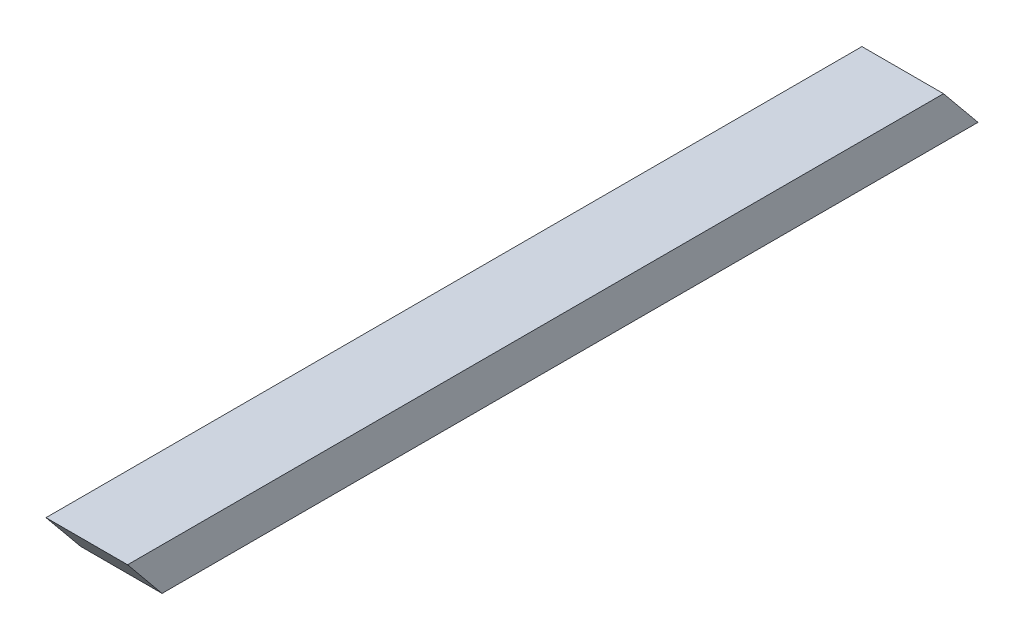
ISO-10303-21;
HEADER;
FILE_DESCRIPTION(('STEP AP214'),'2;1');
FILE_NAME('part.step','',(''),(''),'','','');
FILE_SCHEMA(('AUTOMOTIVE_DESIGN { 1 0 10303 214 1 1 1 1 }'));
ENDSEC;
DATA;
#1=APPLICATION_CONTEXT('core data for automotive mechanical design processes');
#2=APPLICATION_PROTOCOL_DEFINITION('international standard','automotive_design',2000,#1);
#3=PRODUCT_CONTEXT('',#1,'mechanical');
#4=PRODUCT('Part','Part','',(#3));
#5=PRODUCT_RELATED_PRODUCT_CATEGORY('part','',(#4));
#6=PRODUCT_DEFINITION_FORMATION('','',#4);
#7=PRODUCT_DEFINITION_CONTEXT('part definition',#1,'design');
#8=PRODUCT_DEFINITION('design','',#6,#7);
#9=PRODUCT_DEFINITION_SHAPE('','',#8);
#10=(LENGTH_UNIT() NAMED_UNIT(*) SI_UNIT(.MILLI.,.METRE.));
#11=(NAMED_UNIT(*) PLANE_ANGLE_UNIT() SI_UNIT($,.RADIAN.));
#12=(NAMED_UNIT(*) SI_UNIT($,.STERADIAN.) SOLID_ANGLE_UNIT());
#13=UNCERTAINTY_MEASURE_WITH_UNIT(LENGTH_MEASURE(1.E-05),#10,'distance_accuracy_value','');
#14=(GEOMETRIC_REPRESENTATION_CONTEXT(3) GLOBAL_UNCERTAINTY_ASSIGNED_CONTEXT((#13)) GLOBAL_UNIT_ASSIGNED_CONTEXT((#10,
#11,#12)) REPRESENTATION_CONTEXT('',''));
#15=CARTESIAN_POINT('',(0.,0.,0.));
#16=DIRECTION('',(0.,0.,1.));
#17=DIRECTION('',(1.,0.,0.));
#18=AXIS2_PLACEMENT_3D('',#15,#16,#17);
#19=CARTESIAN_POINT('',(30.,38.4,155.941600228427));
#20=DIRECTION('',(0.,-1.,0.));
#21=DIRECTION('',(0.,0.,-1.));
#22=AXIS2_PLACEMENT_3D('',#19,#20,#21);
#23=PLANE('',#22);
#24=DIRECTION('',(0.,0.,1.));
#25=VECTOR('',#24,1.);
#26=CARTESIAN_POINT('',(0.,38.4,155.941600228427));
#27=LINE('',#26,#25);
#28=CARTESIAN_POINT('',(0.,38.4,-144.058399771573));
#29=VERTEX_POINT('',#28);
#30=CARTESIAN_POINT('',(0.,38.4,155.941600228427));
#31=VERTEX_POINT('',#30);
#32=EDGE_CURVE('E107',#29,#31,#27,.T.);
#33=ORIENTED_EDGE('',*,*,#32,.T.);
#34=DIRECTION('',(-1.,0.,0.));
#35=VECTOR('',#34,1.);
#36=CARTESIAN_POINT('',(30.,38.4,155.941600228427));
#37=LINE('',#36,#35);
#38=CARTESIAN_POINT('',(30.,38.4,155.941600228427));
#39=VERTEX_POINT('',#38);
#40=EDGE_CURVE('E11',#39,#31,#37,.T.);
#41=ORIENTED_EDGE('',*,*,#40,.F.);
#42=DIRECTION('',(0.,0.,1.));
#43=VECTOR('',#42,1.);
#44=CARTESIAN_POINT('',(30.,38.4,155.941600228427));
#45=LINE('',#44,#43);
#46=CARTESIAN_POINT('',(30.,38.4,-144.058399771573));
#47=VERTEX_POINT('',#46);
#48=EDGE_CURVE('E91',#47,#39,#45,.T.);
#49=ORIENTED_EDGE('',*,*,#48,.F.);
#50=DIRECTION('',(-1.,0.,0.));
#51=VECTOR('',#50,1.);
#52=CARTESIAN_POINT('',(30.,38.4,-144.058399771573));
#53=LINE('',#52,#51);
#54=EDGE_CURVE('E103',#47,#29,#53,.T.);
#55=ORIENTED_EDGE('',*,*,#54,.T.);
#56=EDGE_LOOP('',(#33,#41,#49,#55));
#57=FACE_BOUND('',#56,.T.);
#58=ADVANCED_FACE('F39',(#57),#23,.F.);
#59=CARTESIAN_POINT('',(30.,38.4,155.941600228427));
#60=DIRECTION('',(0.,0.633745166987707,-0.773541894999697));
#61=DIRECTION('',(0.,0.773541894999697,0.633745166987707));
#62=AXIS2_PLACEMENT_3D('',#59,#60,#61);
#63=PLANE('',#62);
#64=DIRECTION('',(0.,-0.773541894999697,-0.633745166987707));
#65=VECTOR('',#64,1.);
#66=CARTESIAN_POINT('',(0.,38.4,155.941600228427));
#67=LINE('',#66,#65);
#68=CARTESIAN_POINT('',(0.,22.929162100006,143.266696888673));
#69=VERTEX_POINT('',#68);
#70=EDGE_CURVE('E96',#31,#69,#67,.T.);
#71=ORIENTED_EDGE('',*,*,#70,.T.);
#72=DIRECTION('',(-1.,0.,0.));
#73=VECTOR('',#72,1.);
#74=CARTESIAN_POINT('',(30.,22.929162100006,143.266696888673));
#75=LINE('',#74,#73);
#76=CARTESIAN_POINT('',(30.,22.929162100006,143.266696888673));
#77=VERTEX_POINT('',#76);
#78=EDGE_CURVE('E48',#77,#69,#75,.T.);
#79=ORIENTED_EDGE('',*,*,#78,.F.);
#80=DIRECTION('',(0.,-0.773541894999697,-0.633745166987707));
#81=VECTOR('',#80,1.);
#82=CARTESIAN_POINT('',(30.,38.4,155.941600228427));
#83=LINE('',#82,#81);
#84=EDGE_CURVE('E86',#39,#77,#83,.T.);
#85=ORIENTED_EDGE('',*,*,#84,.F.);
#86=ORIENTED_EDGE('',*,*,#40,.T.);
#87=EDGE_LOOP('',(#71,#79,#85,#86));
#88=FACE_BOUND('',#87,.T.);
#89=ADVANCED_FACE('F95',(#88),#63,.F.);
#90=CARTESIAN_POINT('',(30.,22.929162100006,143.266696888673));
#91=DIRECTION('',(0.,1.,0.));
#92=DIRECTION('',(0.,0.,1.));
#93=AXIS2_PLACEMENT_3D('',#90,#91,#92);
#94=PLANE('',#93);
#95=DIRECTION('',(0.,0.,-1.));
#96=VECTOR('',#95,1.);
#97=CARTESIAN_POINT('',(0.,22.929162100006,143.266696888673));
#98=LINE('',#97,#96);
#99=CARTESIAN_POINT('',(0.,22.929162100006,-156.733303111327));
#100=VERTEX_POINT('',#99);
#101=EDGE_CURVE('E73',#69,#100,#98,.T.);
#102=ORIENTED_EDGE('',*,*,#101,.T.);
#103=DIRECTION('',(-1.,0.,0.));
#104=VECTOR('',#103,1.);
#105=CARTESIAN_POINT('',(30.,22.929162100006,-156.733303111327));
#106=LINE('',#105,#104);
#107=CARTESIAN_POINT('',(30.,22.929162100006,-156.733303111327));
#108=VERTEX_POINT('',#107);
#109=EDGE_CURVE('E98',#108,#100,#106,.T.);
#110=ORIENTED_EDGE('',*,*,#109,.F.);
#111=DIRECTION('',(0.,0.,-1.));
#112=VECTOR('',#111,1.);
#113=CARTESIAN_POINT('',(30.,22.929162100006,143.266696888673));
#114=LINE('',#113,#112);
#115=EDGE_CURVE('E89',#77,#108,#114,.T.);
#116=ORIENTED_EDGE('',*,*,#115,.F.);
#117=ORIENTED_EDGE('',*,*,#78,.T.);
#118=EDGE_LOOP('',(#102,#110,#116,#117));
#119=FACE_BOUND('',#118,.T.);
#120=ADVANCED_FACE('F99',(#119),#94,.F.);
#121=CARTESIAN_POINT('',(30.,22.929162100006,-156.733303111327));
#122=DIRECTION('',(0.,-0.633745166987707,0.773541894999698));
#123=DIRECTION('',(0.,-0.773541894999698,-0.633745166987707));
#124=AXIS2_PLACEMENT_3D('',#121,#122,#123);
#125=PLANE('',#124);
#126=DIRECTION('',(0.,0.773541894999698,0.633745166987707));
#127=VECTOR('',#126,1.);
#128=CARTESIAN_POINT('',(0.,22.929162100006,-156.733303111327));
#129=LINE('',#128,#127);
#130=EDGE_CURVE('E79',#100,#29,#129,.T.);
#131=ORIENTED_EDGE('',*,*,#130,.T.);
#132=ORIENTED_EDGE('',*,*,#54,.F.);
#133=DIRECTION('',(0.,0.773541894999698,0.633745166987707));
#134=VECTOR('',#133,1.);
#135=CARTESIAN_POINT('',(30.,22.929162100006,-156.733303111327));
#136=LINE('',#135,#134);
#137=EDGE_CURVE('E56',#108,#47,#136,.T.);
#138=ORIENTED_EDGE('',*,*,#137,.F.);
#139=ORIENTED_EDGE('',*,*,#109,.T.);
#140=EDGE_LOOP('',(#131,#132,#138,#139));
#141=FACE_BOUND('',#140,.T.);
#142=ADVANCED_FACE('F120',(#141),#125,.F.);
#143=CARTESIAN_POINT('',(30.,0.,0.));
#144=DIRECTION('',(1.,0.,0.));
#145=DIRECTION('',(0.,0.,-1.));
#146=AXIS2_PLACEMENT_3D('',#143,#144,#145);
#147=PLANE('',#146);
#148=ORIENTED_EDGE('',*,*,#48,.T.);
#149=ORIENTED_EDGE('',*,*,#84,.T.);
#150=ORIENTED_EDGE('',*,*,#115,.T.);
#151=ORIENTED_EDGE('',*,*,#137,.T.);
#152=EDGE_LOOP('',(#148,#149,#150,#151));
#153=FACE_BOUND('',#152,.T.);
#154=ADVANCED_FACE('F87',(#153),#147,.T.);
#155=CARTESIAN_POINT('',(0.,0.,0.));
#156=DIRECTION('',(1.,0.,0.));
#157=DIRECTION('',(0.,0.,-1.));
#158=AXIS2_PLACEMENT_3D('',#155,#156,#157);
#159=PLANE('',#158);
#160=ORIENTED_EDGE('',*,*,#32,.F.);
#161=ORIENTED_EDGE('',*,*,#130,.F.);
#162=ORIENTED_EDGE('',*,*,#101,.F.);
#163=ORIENTED_EDGE('',*,*,#70,.F.);
#164=EDGE_LOOP('',(#160,#161,#162,#163));
#165=FACE_BOUND('',#164,.T.);
#166=ADVANCED_FACE('F123',(#165),#159,.F.);
#167=CLOSED_SHELL('',(#58,#89,#120,#142,#154,#166));
#168=MANIFOLD_SOLID_BREP('B2',#167);
#169=ADVANCED_BREP_SHAPE_REPRESENTATION('',(#18,#168),#14);
#170=SHAPE_DEFINITION_REPRESENTATION(#9,#169);
ENDSEC;
END-ISO-10303-21;
